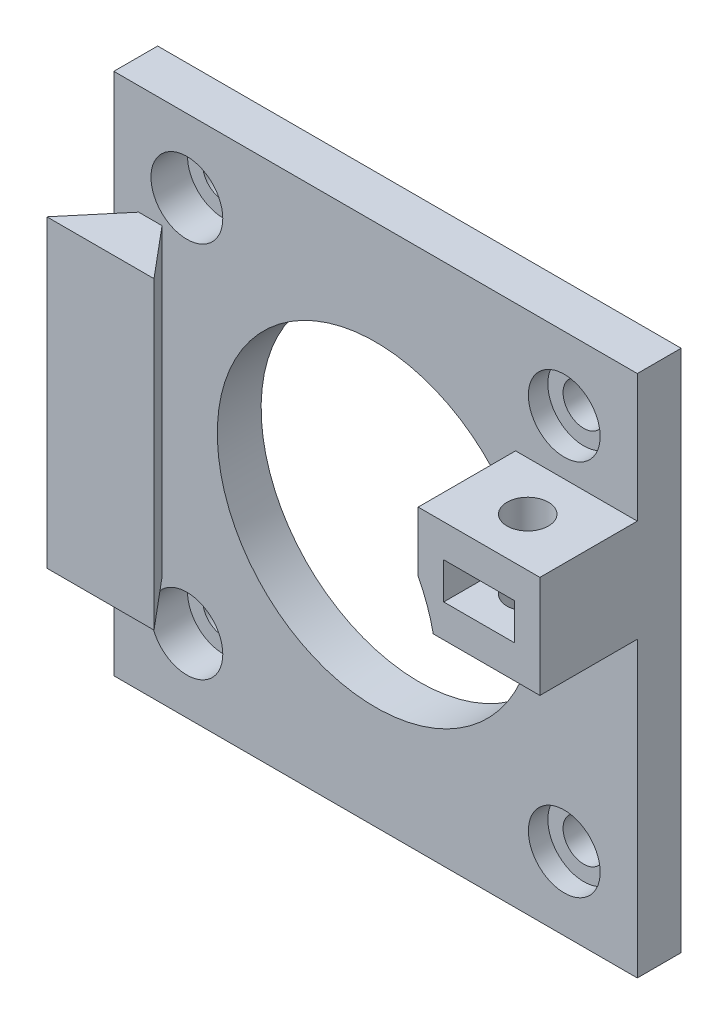
ISO-10303-21;
HEADER;
FILE_DESCRIPTION(('STEP AP214'),'2;1');
FILE_NAME('part.step','',(''),(''),'','','');
FILE_SCHEMA(('AUTOMOTIVE_DESIGN { 1 0 10303 214 1 1 1 1 }'));
ENDSEC;
DATA;
#1=APPLICATION_CONTEXT('core data for automotive mechanical design processes');
#2=APPLICATION_PROTOCOL_DEFINITION('international standard','automotive_design',2000,#1);
#3=PRODUCT_CONTEXT('',#1,'mechanical');
#4=PRODUCT('Part','Part','',(#3));
#5=PRODUCT_RELATED_PRODUCT_CATEGORY('part','',(#4));
#6=PRODUCT_DEFINITION_FORMATION('','',#4);
#7=PRODUCT_DEFINITION_CONTEXT('part definition',#1,'design');
#8=PRODUCT_DEFINITION('design','',#6,#7);
#9=PRODUCT_DEFINITION_SHAPE('','',#8);
#10=(LENGTH_UNIT() NAMED_UNIT(*) SI_UNIT(.MILLI.,.METRE.));
#11=(NAMED_UNIT(*) PLANE_ANGLE_UNIT() SI_UNIT($,.RADIAN.));
#12=(NAMED_UNIT(*) SI_UNIT($,.STERADIAN.) SOLID_ANGLE_UNIT());
#13=UNCERTAINTY_MEASURE_WITH_UNIT(LENGTH_MEASURE(1.E-05),#10,'distance_accuracy_value','');
#14=(GEOMETRIC_REPRESENTATION_CONTEXT(3) GLOBAL_UNCERTAINTY_ASSIGNED_CONTEXT((#13)) GLOBAL_UNIT_ASSIGNED_CONTEXT((#10,
#11,#12)) REPRESENTATION_CONTEXT('',''));
#15=CARTESIAN_POINT('',(0.,0.,0.));
#16=DIRECTION('',(0.,0.,1.));
#17=DIRECTION('',(1.,0.,0.));
#18=AXIS2_PLACEMENT_3D('',#15,#16,#17);
#19=CARTESIAN_POINT('',(-15.5,15.5,3.6));
#20=DIRECTION('',(0.,0.,-1.));
#21=DIRECTION('',(-1.,0.,0.));
#22=AXIS2_PLACEMENT_3D('',#19,#20,#21);
#23=CYLINDRICAL_SURFACE('',#22,1.7);
#24=CARTESIAN_POINT('',(-15.5,15.5,0.));
#25=DIRECTION('',(0.,0.,1.));
#26=DIRECTION('',(1.,0.,0.));
#27=AXIS2_PLACEMENT_3D('',#24,#25,#26);
#28=CIRCLE('',#27,1.7);
#29=CARTESIAN_POINT('',(-13.8,15.5,0.));
#30=VERTEX_POINT('',#29);
#31=EDGE_CURVE('E348',#30,#30,#28,.T.);
#32=ORIENTED_EDGE('',*,*,#31,.F.);
#33=EDGE_LOOP('',(#32));
#34=FACE_BOUND('',#33,.T.);
#35=CARTESIAN_POINT('',(-15.5,15.5,0.6));
#36=DIRECTION('',(0.,0.,1.));
#37=DIRECTION('',(1.,0.,0.));
#38=AXIS2_PLACEMENT_3D('',#35,#36,#37);
#39=CIRCLE('',#38,1.7);
#40=CARTESIAN_POINT('',(-13.8,15.5,0.6));
#41=VERTEX_POINT('',#40);
#42=EDGE_CURVE('E44',#41,#41,#39,.T.);
#43=ORIENTED_EDGE('',*,*,#42,.T.);
#44=EDGE_LOOP('',(#43));
#45=FACE_BOUND('',#44,.T.);
#46=ADVANCED_FACE('F40',(#34,#45),#23,.F.);
#47=CARTESIAN_POINT('',(-15.5,-15.5,3.6));
#48=DIRECTION('',(0.,0.,-1.));
#49=DIRECTION('',(-1.,0.,0.));
#50=AXIS2_PLACEMENT_3D('',#47,#48,#49);
#51=CYLINDRICAL_SURFACE('',#50,1.7);
#52=CARTESIAN_POINT('',(-15.5,-15.5,0.));
#53=DIRECTION('',(0.,0.,1.));
#54=DIRECTION('',(1.,0.,0.));
#55=AXIS2_PLACEMENT_3D('',#52,#53,#54);
#56=CIRCLE('',#55,1.7);
#57=CARTESIAN_POINT('',(-13.8,-15.5,0.));
#58=VERTEX_POINT('',#57);
#59=EDGE_CURVE('E344',#58,#58,#56,.T.);
#60=ORIENTED_EDGE('',*,*,#59,.F.);
#61=EDGE_LOOP('',(#60));
#62=FACE_BOUND('',#61,.T.);
#63=CARTESIAN_POINT('',(-15.5,-15.5,0.6));
#64=DIRECTION('',(0.,0.,1.));
#65=DIRECTION('',(1.,0.,0.));
#66=AXIS2_PLACEMENT_3D('',#63,#64,#65);
#67=CIRCLE('',#66,1.7);
#68=CARTESIAN_POINT('',(-13.8,-15.5,0.6));
#69=VERTEX_POINT('',#68);
#70=EDGE_CURVE('E197',#69,#69,#67,.T.);
#71=ORIENTED_EDGE('',*,*,#70,.T.);
#72=EDGE_LOOP('',(#71));
#73=FACE_BOUND('',#72,.T.);
#74=ADVANCED_FACE('F468',(#62,#73),#51,.F.);
#75=CARTESIAN_POINT('',(16.5,12.6,7.6));
#76=DIRECTION('',(0.,-1.,0.));
#77=DIRECTION('',(1.,0.,0.));
#78=AXIS2_PLACEMENT_3D('',#75,#76,#77);
#79=CYLINDRICAL_SURFACE('',#78,1.7);
#80=CARTESIAN_POINT('',(16.5,11.,7.6));
#81=DIRECTION('',(0.,-1.,0.));
#82=DIRECTION('',(1.,0.,0.));
#83=AXIS2_PLACEMENT_3D('',#80,#81,#82);
#84=CIRCLE('',#83,1.7);
#85=CARTESIAN_POINT('',(18.2,11.,7.6));
#86=VERTEX_POINT('',#85);
#87=EDGE_CURVE('E261',#86,#86,#84,.T.);
#88=ORIENTED_EDGE('',*,*,#87,.F.);
#89=EDGE_LOOP('',(#88));
#90=FACE_BOUND('',#89,.T.);
#91=CARTESIAN_POINT('',(16.5,8.29999999999988,7.6));
#92=DIRECTION('',(0.,-1.,0.));
#93=DIRECTION('',(1.,0.,0.));
#94=AXIS2_PLACEMENT_3D('',#91,#92,#93);
#95=CIRCLE('',#94,1.7);
#96=CARTESIAN_POINT('',(18.2,8.29999999999987,7.6));
#97=VERTEX_POINT('',#96);
#98=EDGE_CURVE('E248',#97,#97,#95,.F.);
#99=ORIENTED_EDGE('',*,*,#98,.F.);
#100=EDGE_LOOP('',(#99));
#101=FACE_BOUND('',#100,.T.);
#102=ADVANCED_FACE('F474',(#90,#101),#79,.F.);
#103=CARTESIAN_POINT('',(15.5,-15.5,3.6));
#104=DIRECTION('',(0.,0.,-1.));
#105=DIRECTION('',(-1.,0.,0.));
#106=AXIS2_PLACEMENT_3D('',#103,#104,#105);
#107=CYLINDRICAL_SURFACE('',#106,1.7);
#108=CARTESIAN_POINT('',(15.5,-15.5,0.));
#109=DIRECTION('',(0.,0.,1.));
#110=DIRECTION('',(1.,0.,0.));
#111=AXIS2_PLACEMENT_3D('',#108,#109,#110);
#112=CIRCLE('',#111,1.7);
#113=CARTESIAN_POINT('',(17.2,-15.5,0.));
#114=VERTEX_POINT('',#113);
#115=EDGE_CURVE('E339',#114,#114,#112,.T.);
#116=ORIENTED_EDGE('',*,*,#115,.F.);
#117=EDGE_LOOP('',(#116));
#118=FACE_BOUND('',#117,.T.);
#119=CARTESIAN_POINT('',(15.5,-15.5,2.));
#120=DIRECTION('',(0.,0.,1.));
#121=DIRECTION('',(1.,0.,0.));
#122=AXIS2_PLACEMENT_3D('',#119,#120,#121);
#123=CIRCLE('',#122,1.7);
#124=CARTESIAN_POINT('',(17.2,-15.5,2.));
#125=VERTEX_POINT('',#124);
#126=EDGE_CURVE('E340',#125,#125,#123,.T.);
#127=ORIENTED_EDGE('',*,*,#126,.T.);
#128=EDGE_LOOP('',(#127));
#129=FACE_BOUND('',#128,.T.);
#130=ADVANCED_FACE('F620',(#118,#129),#107,.F.);
#131=CARTESIAN_POINT('',(15.5,15.5,3.6));
#132=DIRECTION('',(0.,0.,-1.));
#133=DIRECTION('',(-1.,0.,0.));
#134=AXIS2_PLACEMENT_3D('',#131,#132,#133);
#135=CYLINDRICAL_SURFACE('',#134,1.7);
#136=CARTESIAN_POINT('',(15.5,15.5,0.));
#137=DIRECTION('',(0.,0.,1.));
#138=DIRECTION('',(1.,0.,0.));
#139=AXIS2_PLACEMENT_3D('',#136,#137,#138);
#140=CIRCLE('',#139,1.7);
#141=CARTESIAN_POINT('',(17.2,15.5,0.));
#142=VERTEX_POINT('',#141);
#143=EDGE_CURVE('E335',#142,#142,#140,.T.);
#144=ORIENTED_EDGE('',*,*,#143,.F.);
#145=EDGE_LOOP('',(#144));
#146=FACE_BOUND('',#145,.T.);
#147=CARTESIAN_POINT('',(15.5,15.5,2.));
#148=DIRECTION('',(0.,0.,1.));
#149=DIRECTION('',(1.,0.,0.));
#150=AXIS2_PLACEMENT_3D('',#147,#148,#149);
#151=CIRCLE('',#150,1.7);
#152=CARTESIAN_POINT('',(17.2,15.5,2.));
#153=VERTEX_POINT('',#152);
#154=EDGE_CURVE('E334',#153,#153,#151,.T.);
#155=ORIENTED_EDGE('',*,*,#154,.T.);
#156=EDGE_LOOP('',(#155));
#157=FACE_BOUND('',#156,.T.);
#158=ADVANCED_FACE('F491',(#146,#157),#135,.F.);
#159=CARTESIAN_POINT('',(0.,0.,3.6));
#160=DIRECTION('',(0.,0.,1.));
#161=DIRECTION('',(1.,0.,0.));
#162=AXIS2_PLACEMENT_3D('',#159,#160,#161);
#163=PLANE('',#162);
#164=DIRECTION('',(1.,0.,0.));
#165=VECTOR('',#164,1.);
#166=CARTESIAN_POINT('',(0.,-12.5,3.6));
#167=LINE('',#166,#165);
#168=CARTESIAN_POINT('',(-19.4596915121731,-12.5,3.6));
#169=VERTEX_POINT('',#168);
#170=CARTESIAN_POINT('',(-17.5403084878269,-12.5,3.6));
#171=VERTEX_POINT('',#170);
#172=EDGE_CURVE('E11',#169,#171,#167,.T.);
#173=ORIENTED_EDGE('',*,*,#172,.F.);
#174=DIRECTION('',(0.,-1.,0.));
#175=VECTOR('',#174,1.);
#176=CARTESIAN_POINT('',(-19.4596915121731,0.,3.6));
#177=LINE('',#176,#175);
#178=CARTESIAN_POINT('',(-19.4596915121731,12.5,3.6));
#179=VERTEX_POINT('',#178);
#180=EDGE_CURVE('E50',#179,#169,#177,.T.);
#181=ORIENTED_EDGE('',*,*,#180,.F.);
#182=DIRECTION('',(1.,0.,0.));
#183=VECTOR('',#182,1.);
#184=CARTESIAN_POINT('',(0.,12.5,3.6));
#185=LINE('',#184,#183);
#186=CARTESIAN_POINT('',(-17.5403084878269,12.5,3.6));
#187=VERTEX_POINT('',#186);
#188=EDGE_CURVE('E426',#179,#187,#185,.T.);
#189=ORIENTED_EDGE('',*,*,#188,.T.);
#190=DIRECTION('',(0.,1.,0.));
#191=VECTOR('',#190,1.);
#192=CARTESIAN_POINT('',(-17.5403084878269,0.,3.6));
#193=LINE('',#192,#191);
#194=EDGE_CURVE('E184',#171,#187,#193,.T.);
#195=ORIENTED_EDGE('',*,*,#194,.F.);
#196=EDGE_LOOP('',(#173,#181,#189,#195));
#197=FACE_BOUND('',#196,.T.);
#198=DIRECTION('',(0.,-1.,0.));
#199=VECTOR('',#198,1.);
#200=CARTESIAN_POINT('',(11.5,6.06217782649108,3.6));
#201=LINE('',#200,#199);
#202=CARTESIAN_POINT('',(11.5,11.,3.6));
#203=VERTEX_POINT('',#202);
#204=CARTESIAN_POINT('',(11.5,6.06217782649109,3.6));
#205=VERTEX_POINT('',#204);
#206=EDGE_CURVE('E280',#203,#205,#201,.T.);
#207=ORIENTED_EDGE('',*,*,#206,.F.);
#208=DIRECTION('',(-1.,0.,0.));
#209=VECTOR('',#208,1.);
#210=CARTESIAN_POINT('',(21.5,11.,3.6));
#211=LINE('',#210,#209);
#212=CARTESIAN_POINT('',(21.5,11.,3.6));
#213=VERTEX_POINT('',#212);
#214=EDGE_CURVE('E267',#213,#203,#211,.T.);
#215=ORIENTED_EDGE('',*,*,#214,.F.);
#216=DIRECTION('',(0.,1.,0.));
#217=VECTOR('',#216,1.);
#218=CARTESIAN_POINT('',(21.5,-21.5,3.6));
#219=LINE('',#218,#217);
#220=CARTESIAN_POINT('',(21.5,21.5,3.6));
#221=VERTEX_POINT('',#220);
#222=EDGE_CURVE('E369',#213,#221,#219,.T.);
#223=ORIENTED_EDGE('',*,*,#222,.T.);
#224=DIRECTION('',(-1.,0.,0.));
#225=VECTOR('',#224,1.);
#226=CARTESIAN_POINT('',(21.5,21.5,3.6));
#227=LINE('',#226,#225);
#228=CARTESIAN_POINT('',(-21.5,21.5,3.6));
#229=VERTEX_POINT('',#228);
#230=EDGE_CURVE('E373',#221,#229,#227,.T.);
#231=ORIENTED_EDGE('',*,*,#230,.T.);
#232=DIRECTION('',(0.,-1.,0.));
#233=VECTOR('',#232,1.);
#234=CARTESIAN_POINT('',(-21.5,-21.5,3.6));
#235=LINE('',#234,#233);
#236=CARTESIAN_POINT('',(-21.5,-21.5,3.6));
#237=VERTEX_POINT('',#236);
#238=EDGE_CURVE('E361',#229,#237,#235,.T.);
#239=ORIENTED_EDGE('',*,*,#238,.T.);
#240=DIRECTION('',(1.,0.,0.));
#241=VECTOR('',#240,1.);
#242=CARTESIAN_POINT('',(21.5,-21.5,3.6));
#243=LINE('',#242,#241);
#244=CARTESIAN_POINT('',(21.5,-21.5,3.6));
#245=VERTEX_POINT('',#244);
#246=EDGE_CURVE('E365',#237,#245,#243,.T.);
#247=ORIENTED_EDGE('',*,*,#246,.T.);
#248=CARTESIAN_POINT('',(21.5,2.6,3.6));
#249=VERTEX_POINT('',#248);
#250=EDGE_CURVE('E370',#245,#249,#219,.T.);
#251=ORIENTED_EDGE('',*,*,#250,.T.);
#252=DIRECTION('',(1.,0.,0.));
#253=VECTOR('',#252,1.);
#254=CARTESIAN_POINT('',(21.5,2.6,3.6));
#255=LINE('',#254,#253);
#256=CARTESIAN_POINT('',(12.7373466624725,2.6,3.6));
#257=VERTEX_POINT('',#256);
#258=EDGE_CURVE('E284',#257,#249,#255,.T.);
#259=ORIENTED_EDGE('',*,*,#258,.F.);
#260=CARTESIAN_POINT('',(0.,0.,3.6));
#261=DIRECTION('',(0.,0.,1.));
#262=DIRECTION('',(1.,0.,0.));
#263=AXIS2_PLACEMENT_3D('',#260,#261,#262);
#264=CIRCLE('',#263,13.);
#265=EDGE_CURVE('E353',#205,#257,#264,.T.);
#266=ORIENTED_EDGE('',*,*,#265,.F.);
#267=EDGE_LOOP('',(#207,#215,#223,#231,#239,#247,#251,#259,#266));
#268=FACE_BOUND('',#267,.T.);
#269=CARTESIAN_POINT('',(15.5,15.5,3.6));
#270=DIRECTION('',(0.,0.,1.));
#271=DIRECTION('',(1.,0.,0.));
#272=AXIS2_PLACEMENT_3D('',#269,#270,#271);
#273=CIRCLE('',#272,2.95);
#274=CARTESIAN_POINT('',(18.45,15.5,3.6));
#275=VERTEX_POINT('',#274);
#276=EDGE_CURVE('E324',#275,#275,#273,.T.);
#277=ORIENTED_EDGE('',*,*,#276,.F.);
#278=EDGE_LOOP('',(#277));
#279=FACE_BOUND('',#278,.T.);
#280=CARTESIAN_POINT('',(-15.5,-15.5,3.6));
#281=DIRECTION('',(0.,0.,1.));
#282=DIRECTION('',(1.,0.,0.));
#283=AXIS2_PLACEMENT_3D('',#280,#281,#282);
#284=CIRCLE('',#283,2.95);
#285=CARTESIAN_POINT('',(-12.55,-15.5,3.6));
#286=VERTEX_POINT('',#285);
#287=EDGE_CURVE('E315',#286,#286,#284,.T.);
#288=ORIENTED_EDGE('',*,*,#287,.F.);
#289=EDGE_LOOP('',(#288));
#290=FACE_BOUND('',#289,.T.);
#291=CARTESIAN_POINT('',(15.5,-15.5,3.6));
#292=DIRECTION('',(0.,0.,1.));
#293=DIRECTION('',(1.,0.,0.));
#294=AXIS2_PLACEMENT_3D('',#291,#292,#293);
#295=CIRCLE('',#294,2.95);
#296=CARTESIAN_POINT('',(18.45,-15.5,3.6));
#297=VERTEX_POINT('',#296);
#298=EDGE_CURVE('E310',#297,#297,#295,.T.);
#299=ORIENTED_EDGE('',*,*,#298,.F.);
#300=EDGE_LOOP('',(#299));
#301=FACE_BOUND('',#300,.T.);
#302=CARTESIAN_POINT('',(-15.5,15.5,3.6));
#303=DIRECTION('',(0.,0.,1.));
#304=DIRECTION('',(1.,0.,0.));
#305=AXIS2_PLACEMENT_3D('',#302,#303,#304);
#306=CIRCLE('',#305,2.95);
#307=CARTESIAN_POINT('',(-12.55,15.5,3.6));
#308=VERTEX_POINT('',#307);
#309=EDGE_CURVE('E323',#308,#308,#306,.T.);
#310=ORIENTED_EDGE('',*,*,#309,.F.);
#311=EDGE_LOOP('',(#310));
#312=FACE_BOUND('',#311,.T.);
#313=ADVANCED_FACE('F487',(#197,#268,#279,#290,#301,#312),#163,.T.);
#314=CARTESIAN_POINT('',(0.,0.,0.));
#315=DIRECTION('',(0.,0.,1.));
#316=DIRECTION('',(1.,0.,0.));
#317=AXIS2_PLACEMENT_3D('',#314,#315,#316);
#318=PLANE('',#317);
#319=DIRECTION('',(0.,-1.,0.));
#320=VECTOR('',#319,1.);
#321=CARTESIAN_POINT('',(-21.5,-21.5,0.));
#322=LINE('',#321,#320);
#323=CARTESIAN_POINT('',(-21.5,21.5,0.));
#324=VERTEX_POINT('',#323);
#325=CARTESIAN_POINT('',(-21.5,-21.5,0.));
#326=VERTEX_POINT('',#325);
#327=EDGE_CURVE('E357',#324,#326,#322,.T.);
#328=ORIENTED_EDGE('',*,*,#327,.F.);
#329=DIRECTION('',(-1.,0.,0.));
#330=VECTOR('',#329,1.);
#331=CARTESIAN_POINT('',(21.5,21.5,0.));
#332=LINE('',#331,#330);
#333=CARTESIAN_POINT('',(21.5,21.5,0.));
#334=VERTEX_POINT('',#333);
#335=EDGE_CURVE('E366',#334,#324,#332,.T.);
#336=ORIENTED_EDGE('',*,*,#335,.F.);
#337=DIRECTION('',(0.,1.,0.));
#338=VECTOR('',#337,1.);
#339=CARTESIAN_POINT('',(21.5,-21.5,0.));
#340=LINE('',#339,#338);
#341=CARTESIAN_POINT('',(21.5,-21.5,0.));
#342=VERTEX_POINT('',#341);
#343=EDGE_CURVE('E383',#342,#334,#340,.T.);
#344=ORIENTED_EDGE('',*,*,#343,.F.);
#345=DIRECTION('',(1.,0.,0.));
#346=VECTOR('',#345,1.);
#347=CARTESIAN_POINT('',(21.5,-21.5,0.));
#348=LINE('',#347,#346);
#349=EDGE_CURVE('E380',#326,#342,#348,.T.);
#350=ORIENTED_EDGE('',*,*,#349,.F.);
#351=EDGE_LOOP('',(#328,#336,#344,#350));
#352=FACE_BOUND('',#351,.T.);
#353=CARTESIAN_POINT('',(0.,0.,0.));
#354=DIRECTION('',(0.,0.,1.));
#355=DIRECTION('',(1.,0.,0.));
#356=AXIS2_PLACEMENT_3D('',#353,#354,#355);
#357=CIRCLE('',#356,13.);
#358=CARTESIAN_POINT('',(13.,0.,0.));
#359=VERTEX_POINT('',#358);
#360=EDGE_CURVE('E352',#359,#359,#357,.T.);
#361=ORIENTED_EDGE('',*,*,#360,.T.);
#362=EDGE_LOOP('',(#361));
#363=FACE_BOUND('',#362,.T.);
#364=ORIENTED_EDGE('',*,*,#31,.T.);
#365=EDGE_LOOP('',(#364));
#366=FACE_BOUND('',#365,.T.);
#367=ORIENTED_EDGE('',*,*,#59,.T.);
#368=EDGE_LOOP('',(#367));
#369=FACE_BOUND('',#368,.T.);
#370=ORIENTED_EDGE('',*,*,#115,.T.);
#371=EDGE_LOOP('',(#370));
#372=FACE_BOUND('',#371,.T.);
#373=ORIENTED_EDGE('',*,*,#143,.T.);
#374=EDGE_LOOP('',(#373));
#375=FACE_BOUND('',#374,.T.);
#376=ADVANCED_FACE('F490',(#352,#363,#366,#369,#372,#375),#318,.F.);
#377=CARTESIAN_POINT('',(-21.5,-21.5,3.6));
#378=DIRECTION('',(1.,0.,0.));
#379=DIRECTION('',(0.,0.,-1.));
#380=AXIS2_PLACEMENT_3D('',#377,#378,#379);
#381=PLANE('',#380);
#382=ORIENTED_EDGE('',*,*,#327,.T.);
#383=DIRECTION('',(0.,0.,-1.));
#384=VECTOR('',#383,1.);
#385=CARTESIAN_POINT('',(-21.5,-21.5,3.6));
#386=LINE('',#385,#384);
#387=EDGE_CURVE('E399',#237,#326,#386,.T.);
#388=ORIENTED_EDGE('',*,*,#387,.F.);
#389=ORIENTED_EDGE('',*,*,#238,.F.);
#390=DIRECTION('',(0.,0.,-1.));
#391=VECTOR('',#390,1.);
#392=CARTESIAN_POINT('',(-21.5,21.5,3.6));
#393=LINE('',#392,#391);
#394=EDGE_CURVE('E376',#229,#324,#393,.T.);
#395=ORIENTED_EDGE('',*,*,#394,.T.);
#396=EDGE_LOOP('',(#382,#388,#389,#395));
#397=FACE_BOUND('',#396,.T.);
#398=ADVANCED_FACE('F42',(#397),#381,.F.);
#399=CARTESIAN_POINT('',(21.5,-21.5,3.6));
#400=DIRECTION('',(0.,1.,0.));
#401=DIRECTION('',(-1.,0.,0.));
#402=AXIS2_PLACEMENT_3D('',#399,#400,#401);
#403=PLANE('',#402);
#404=ORIENTED_EDGE('',*,*,#349,.T.);
#405=DIRECTION('',(0.,0.,-1.));
#406=VECTOR('',#405,1.);
#407=CARTESIAN_POINT('',(21.5,-21.5,3.6));
#408=LINE('',#407,#406);
#409=EDGE_CURVE('E395',#245,#342,#408,.T.);
#410=ORIENTED_EDGE('',*,*,#409,.F.);
#411=ORIENTED_EDGE('',*,*,#246,.F.);
#412=ORIENTED_EDGE('',*,*,#387,.T.);
#413=EDGE_LOOP('',(#404,#410,#411,#412));
#414=FACE_BOUND('',#413,.T.);
#415=ADVANCED_FACE('F501',(#414),#403,.F.);
#416=CARTESIAN_POINT('',(21.5,-21.5,3.6));
#417=DIRECTION('',(-1.,0.,0.));
#418=DIRECTION('',(0.,0.,1.));
#419=AXIS2_PLACEMENT_3D('',#416,#417,#418);
#420=PLANE('',#419);
#421=ORIENTED_EDGE('',*,*,#343,.T.);
#422=DIRECTION('',(0.,0.,-1.));
#423=VECTOR('',#422,1.);
#424=CARTESIAN_POINT('',(21.5,21.5,3.6));
#425=LINE('',#424,#423);
#426=EDGE_CURVE('E391',#221,#334,#425,.T.);
#427=ORIENTED_EDGE('',*,*,#426,.F.);
#428=ORIENTED_EDGE('',*,*,#222,.F.);
#429=DIRECTION('',(0.,0.,-1.));
#430=VECTOR('',#429,1.);
#431=CARTESIAN_POINT('',(21.5,11.,11.6));
#432=LINE('',#431,#430);
#433=CARTESIAN_POINT('',(21.5,11.,11.6));
#434=VERTEX_POINT('',#433);
#435=EDGE_CURVE('E294',#434,#213,#432,.T.);
#436=ORIENTED_EDGE('',*,*,#435,.F.);
#437=DIRECTION('',(0.,1.,0.));
#438=VECTOR('',#437,1.);
#439=CARTESIAN_POINT('',(21.5,2.6,11.6));
#440=LINE('',#439,#438);
#441=CARTESIAN_POINT('',(21.5,2.6,11.6));
#442=VERTEX_POINT('',#441);
#443=EDGE_CURVE('E273',#442,#434,#440,.T.);
#444=ORIENTED_EDGE('',*,*,#443,.F.);
#445=DIRECTION('',(0.,0.,-1.));
#446=VECTOR('',#445,1.);
#447=CARTESIAN_POINT('',(21.5,2.6,11.6));
#448=LINE('',#447,#446);
#449=EDGE_CURVE('E298',#442,#249,#448,.T.);
#450=ORIENTED_EDGE('',*,*,#449,.T.);
#451=ORIENTED_EDGE('',*,*,#250,.F.);
#452=ORIENTED_EDGE('',*,*,#409,.T.);
#453=EDGE_LOOP('',(#421,#427,#428,#436,#444,#450,#451,#452));
#454=FACE_BOUND('',#453,.T.);
#455=ADVANCED_FACE('F498',(#454),#420,.F.);
#456=CARTESIAN_POINT('',(21.5,21.5,3.6));
#457=DIRECTION('',(0.,-1.,0.));
#458=DIRECTION('',(1.,0.,0.));
#459=AXIS2_PLACEMENT_3D('',#456,#457,#458);
#460=PLANE('',#459);
#461=ORIENTED_EDGE('',*,*,#335,.T.);
#462=ORIENTED_EDGE('',*,*,#394,.F.);
#463=ORIENTED_EDGE('',*,*,#230,.F.);
#464=ORIENTED_EDGE('',*,*,#426,.T.);
#465=EDGE_LOOP('',(#461,#462,#463,#464));
#466=FACE_BOUND('',#465,.T.);
#467=ADVANCED_FACE('F485',(#466),#460,.F.);
#468=CARTESIAN_POINT('',(0.,0.,3.6));
#469=DIRECTION('',(0.,0.,-1.));
#470=DIRECTION('',(-1.,0.,0.));
#471=AXIS2_PLACEMENT_3D('',#468,#469,#470);
#472=CYLINDRICAL_SURFACE('',#471,13.);
#473=ORIENTED_EDGE('',*,*,#265,.T.);
#474=DIRECTION('',(0.,0.,-1.));
#475=VECTOR('',#474,1.);
#476=CARTESIAN_POINT('',(12.7373466624725,2.6,11.6));
#477=LINE('',#476,#475);
#478=CARTESIAN_POINT('',(12.7373466624725,2.6,11.6));
#479=VERTEX_POINT('',#478);
#480=EDGE_CURVE('E302',#479,#257,#477,.T.);
#481=ORIENTED_EDGE('',*,*,#480,.F.);
#482=CARTESIAN_POINT('',(0.,0.,11.6));
#483=DIRECTION('',(0.,0.,-1.));
#484=DIRECTION('',(1.,0.,0.));
#485=AXIS2_PLACEMENT_3D('',#482,#483,#484);
#486=CIRCLE('',#485,13.);
#487=CARTESIAN_POINT('',(11.5,6.06217782649108,11.6));
#488=VERTEX_POINT('',#487);
#489=EDGE_CURVE('E266',#488,#479,#486,.T.);
#490=ORIENTED_EDGE('',*,*,#489,.F.);
#491=DIRECTION('',(0.,0.,-1.));
#492=VECTOR('',#491,1.);
#493=CARTESIAN_POINT('',(11.5,6.06217782649108,11.6));
#494=LINE('',#493,#492);
#495=EDGE_CURVE('E306',#488,#205,#494,.T.);
#496=ORIENTED_EDGE('',*,*,#495,.T.);
#497=EDGE_LOOP('',(#473,#481,#490,#496));
#498=FACE_BOUND('',#497,.T.);
#499=ORIENTED_EDGE('',*,*,#360,.F.);
#500=EDGE_LOOP('',(#499));
#501=FACE_BOUND('',#500,.T.);
#502=ADVANCED_FACE('F481',(#498,#501),#472,.F.);
#503=CARTESIAN_POINT('',(15.5,15.5,2.));
#504=DIRECTION('',(0.,0.,1.));
#505=DIRECTION('',(1.,0.,0.));
#506=AXIS2_PLACEMENT_3D('',#503,#504,#505);
#507=CYLINDRICAL_SURFACE('',#506,2.95);
#508=CARTESIAN_POINT('',(15.5,15.5,2.));
#509=DIRECTION('',(0.,0.,1.));
#510=DIRECTION('',(1.,0.,0.));
#511=AXIS2_PLACEMENT_3D('',#508,#509,#510);
#512=CIRCLE('',#511,2.95);
#513=CARTESIAN_POINT('',(18.45,15.5,2.));
#514=VERTEX_POINT('',#513);
#515=EDGE_CURVE('E319',#514,#514,#512,.T.);
#516=ORIENTED_EDGE('',*,*,#515,.F.);
#517=EDGE_LOOP('',(#516));
#518=FACE_BOUND('',#517,.T.);
#519=ORIENTED_EDGE('',*,*,#276,.T.);
#520=EDGE_LOOP('',(#519));
#521=FACE_BOUND('',#520,.T.);
#522=ADVANCED_FACE('F484',(#518,#521),#507,.F.);
#523=CARTESIAN_POINT('',(15.5,15.5,2.));
#524=DIRECTION('',(0.,0.,1.));
#525=DIRECTION('',(1.,0.,0.));
#526=AXIS2_PLACEMENT_3D('',#523,#524,#525);
#527=PLANE('',#526);
#528=ORIENTED_EDGE('',*,*,#154,.F.);
#529=EDGE_LOOP('',(#528));
#530=FACE_BOUND('',#529,.T.);
#531=ORIENTED_EDGE('',*,*,#515,.T.);
#532=EDGE_LOOP('',(#531));
#533=FACE_BOUND('',#532,.T.);
#534=ADVANCED_FACE('F623',(#530,#533),#527,.T.);
#535=CARTESIAN_POINT('',(15.5,-15.5,2.));
#536=DIRECTION('',(0.,0.,1.));
#537=DIRECTION('',(1.,0.,0.));
#538=AXIS2_PLACEMENT_3D('',#535,#536,#537);
#539=CYLINDRICAL_SURFACE('',#538,2.95);
#540=CARTESIAN_POINT('',(15.5,-15.5,2.));
#541=DIRECTION('',(0.,0.,1.));
#542=DIRECTION('',(1.,0.,0.));
#543=AXIS2_PLACEMENT_3D('',#540,#541,#542);
#544=CIRCLE('',#543,2.95);
#545=CARTESIAN_POINT('',(18.45,-15.5,2.));
#546=VERTEX_POINT('',#545);
#547=EDGE_CURVE('E311',#546,#546,#544,.T.);
#548=ORIENTED_EDGE('',*,*,#547,.F.);
#549=EDGE_LOOP('',(#548));
#550=FACE_BOUND('',#549,.T.);
#551=ORIENTED_EDGE('',*,*,#298,.T.);
#552=EDGE_LOOP('',(#551));
#553=FACE_BOUND('',#552,.T.);
#554=ADVANCED_FACE('F626',(#550,#553),#539,.F.);
#555=CARTESIAN_POINT('',(15.5,-15.5,2.));
#556=DIRECTION('',(0.,0.,1.));
#557=DIRECTION('',(1.,0.,0.));
#558=AXIS2_PLACEMENT_3D('',#555,#556,#557);
#559=PLANE('',#558);
#560=ORIENTED_EDGE('',*,*,#126,.F.);
#561=EDGE_LOOP('',(#560));
#562=FACE_BOUND('',#561,.T.);
#563=ORIENTED_EDGE('',*,*,#547,.T.);
#564=EDGE_LOOP('',(#563));
#565=FACE_BOUND('',#564,.T.);
#566=ADVANCED_FACE('F463',(#562,#565),#559,.T.);
#567=CARTESIAN_POINT('',(-15.5,-15.5,2.));
#568=DIRECTION('',(0.,0.,1.));
#569=DIRECTION('',(1.,0.,0.));
#570=AXIS2_PLACEMENT_3D('',#567,#568,#569);
#571=CYLINDRICAL_SURFACE('',#570,2.95);
#572=ORIENTED_EDGE('',*,*,#287,.T.);
#573=EDGE_LOOP('',(#572));
#574=FACE_BOUND('',#573,.T.);
#575=CARTESIAN_POINT('',(-15.5,-15.5,0.6));
#576=DIRECTION('',(0.,0.,1.));
#577=DIRECTION('',(1.,0.,0.));
#578=AXIS2_PLACEMENT_3D('',#575,#576,#577);
#579=CIRCLE('',#578,2.95);
#580=CARTESIAN_POINT('',(-12.55,-15.5,0.6));
#581=VERTEX_POINT('',#580);
#582=EDGE_CURVE('E434',#581,#581,#579,.T.);
#583=ORIENTED_EDGE('',*,*,#582,.F.);
#584=EDGE_LOOP('',(#583));
#585=FACE_BOUND('',#584,.T.);
#586=ADVANCED_FACE('F453',(#574,#585),#571,.F.);
#587=CARTESIAN_POINT('',(-15.5,15.5,2.));
#588=DIRECTION('',(0.,0.,1.));
#589=DIRECTION('',(1.,0.,0.));
#590=AXIS2_PLACEMENT_3D('',#587,#588,#589);
#591=CYLINDRICAL_SURFACE('',#590,2.95);
#592=ORIENTED_EDGE('',*,*,#309,.T.);
#593=EDGE_LOOP('',(#592));
#594=FACE_BOUND('',#593,.T.);
#595=CARTESIAN_POINT('',(-15.5,15.5,0.6));
#596=DIRECTION('',(0.,0.,1.));
#597=DIRECTION('',(1.,0.,0.));
#598=AXIS2_PLACEMENT_3D('',#595,#596,#597);
#599=CIRCLE('',#598,2.95);
#600=CARTESIAN_POINT('',(-12.55,15.5,0.6));
#601=VERTEX_POINT('',#600);
#602=EDGE_CURVE('E199',#601,#601,#599,.T.);
#603=ORIENTED_EDGE('',*,*,#602,.F.);
#604=EDGE_LOOP('',(#603));
#605=FACE_BOUND('',#604,.T.);
#606=ADVANCED_FACE('F450',(#594,#605),#591,.F.);
#607=CARTESIAN_POINT('',(11.5,6.06217782649108,11.6));
#608=DIRECTION('',(1.,0.,0.));
#609=DIRECTION('',(0.,0.,-1.));
#610=AXIS2_PLACEMENT_3D('',#607,#608,#609);
#611=PLANE('',#610);
#612=ORIENTED_EDGE('',*,*,#206,.T.);
#613=ORIENTED_EDGE('',*,*,#495,.F.);
#614=DIRECTION('',(0.,-1.,0.));
#615=VECTOR('',#614,1.);
#616=CARTESIAN_POINT('',(11.5,6.06217782649108,11.6));
#617=LINE('',#616,#615);
#618=CARTESIAN_POINT('',(11.5,11.,11.6));
#619=VERTEX_POINT('',#618);
#620=EDGE_CURVE('E262',#619,#488,#617,.T.);
#621=ORIENTED_EDGE('',*,*,#620,.F.);
#622=DIRECTION('',(0.,0.,-1.));
#623=VECTOR('',#622,1.);
#624=CARTESIAN_POINT('',(11.5,11.,11.6));
#625=LINE('',#624,#623);
#626=EDGE_CURVE('E279',#619,#203,#625,.T.);
#627=ORIENTED_EDGE('',*,*,#626,.T.);
#628=EDGE_LOOP('',(#612,#613,#621,#627));
#629=FACE_BOUND('',#628,.T.);
#630=ADVANCED_FACE('F452',(#629),#611,.F.);
#631=CARTESIAN_POINT('',(21.5,2.6,11.6));
#632=DIRECTION('',(0.,1.,0.));
#633=DIRECTION('',(-1.,0.,0.));
#634=AXIS2_PLACEMENT_3D('',#631,#632,#633);
#635=PLANE('',#634);
#636=CARTESIAN_POINT('',(16.5,2.6,7.6));
#637=DIRECTION('',(0.,-1.,0.));
#638=DIRECTION('',(1.,0.,0.));
#639=AXIS2_PLACEMENT_3D('',#636,#637,#638);
#640=CIRCLE('',#639,1.7);
#641=CARTESIAN_POINT('',(18.2,2.6,7.6));
#642=VERTEX_POINT('',#641);
#643=EDGE_CURVE('E257',#642,#642,#640,.T.);
#644=ORIENTED_EDGE('',*,*,#643,.F.);
#645=EDGE_LOOP('',(#644));
#646=FACE_BOUND('',#645,.T.);
#647=ORIENTED_EDGE('',*,*,#258,.T.);
#648=ORIENTED_EDGE('',*,*,#449,.F.);
#649=DIRECTION('',(1.,0.,0.));
#650=VECTOR('',#649,1.);
#651=CARTESIAN_POINT('',(21.5,2.6,11.6));
#652=LINE('',#651,#650);
#653=EDGE_CURVE('E270',#479,#442,#652,.T.);
#654=ORIENTED_EDGE('',*,*,#653,.F.);
#655=ORIENTED_EDGE('',*,*,#480,.T.);
#656=EDGE_LOOP('',(#647,#648,#654,#655));
#657=FACE_BOUND('',#656,.T.);
#658=ADVANCED_FACE('F460',(#646,#657),#635,.F.);
#659=CARTESIAN_POINT('',(21.5,11.,11.6));
#660=DIRECTION('',(0.,-1.,0.));
#661=DIRECTION('',(1.,0.,0.));
#662=AXIS2_PLACEMENT_3D('',#659,#660,#661);
#663=PLANE('',#662);
#664=ORIENTED_EDGE('',*,*,#87,.T.);
#665=EDGE_LOOP('',(#664));
#666=FACE_BOUND('',#665,.T.);
#667=ORIENTED_EDGE('',*,*,#214,.T.);
#668=ORIENTED_EDGE('',*,*,#626,.F.);
#669=DIRECTION('',(-1.,0.,0.));
#670=VECTOR('',#669,1.);
#671=CARTESIAN_POINT('',(21.5,11.,11.6));
#672=LINE('',#671,#670);
#673=EDGE_CURVE('E276',#434,#619,#672,.T.);
#674=ORIENTED_EDGE('',*,*,#673,.F.);
#675=ORIENTED_EDGE('',*,*,#435,.T.);
#676=EDGE_LOOP('',(#667,#668,#674,#675));
#677=FACE_BOUND('',#676,.T.);
#678=ADVANCED_FACE('F598',(#666,#677),#663,.F.);
#679=CARTESIAN_POINT('',(0.,0.,11.6));
#680=DIRECTION('',(0.,0.,1.));
#681=DIRECTION('',(1.,0.,0.));
#682=AXIS2_PLACEMENT_3D('',#679,#680,#681);
#683=PLANE('',#682);
#684=DIRECTION('',(1.,0.,0.));
#685=VECTOR('',#684,1.);
#686=CARTESIAN_POINT('',(0.,5.3,11.6));
#687=LINE('',#686,#685);
#688=CARTESIAN_POINT('',(13.5988148973221,5.29999999999991,11.6));
#689=VERTEX_POINT('',#688);
#690=CARTESIAN_POINT('',(19.4011851026779,5.29999999999986,11.6));
#691=VERTEX_POINT('',#690);
#692=EDGE_CURVE('E254',#689,#691,#687,.T.);
#693=ORIENTED_EDGE('',*,*,#692,.F.);
#694=DIRECTION('',(0.,1.,0.));
#695=VECTOR('',#694,1.);
#696=CARTESIAN_POINT('',(13.5988148973221,0.,11.6));
#697=LINE('',#696,#695);
#698=CARTESIAN_POINT('',(13.5988148973222,8.2999999999999,11.6));
#699=VERTEX_POINT('',#698);
#700=EDGE_CURVE('E403',#689,#699,#697,.T.);
#701=ORIENTED_EDGE('',*,*,#700,.T.);
#702=DIRECTION('',(1.,0.,0.));
#703=VECTOR('',#702,1.);
#704=CARTESIAN_POINT('',(0.,8.3,11.6));
#705=LINE('',#704,#703);
#706=CARTESIAN_POINT('',(19.4011851026779,8.29999999999986,11.6));
#707=VERTEX_POINT('',#706);
#708=EDGE_CURVE('E249',#699,#707,#705,.T.);
#709=ORIENTED_EDGE('',*,*,#708,.T.);
#710=DIRECTION('',(0.,-1.,0.));
#711=VECTOR('',#710,1.);
#712=CARTESIAN_POINT('',(19.4011851026778,-1.35477751474882E-13,11.6));
#713=LINE('',#712,#711);
#714=EDGE_CURVE('E422',#707,#691,#713,.T.);
#715=ORIENTED_EDGE('',*,*,#714,.T.);
#716=EDGE_LOOP('',(#693,#701,#709,#715));
#717=FACE_BOUND('',#716,.T.);
#718=ORIENTED_EDGE('',*,*,#620,.T.);
#719=ORIENTED_EDGE('',*,*,#489,.T.);
#720=ORIENTED_EDGE('',*,*,#653,.T.);
#721=ORIENTED_EDGE('',*,*,#443,.T.);
#722=ORIENTED_EDGE('',*,*,#673,.T.);
#723=EDGE_LOOP('',(#718,#719,#720,#721,#722));
#724=FACE_BOUND('',#723,.T.);
#725=ADVANCED_FACE('F602',(#717,#724),#683,.T.);
#726=CARTESIAN_POINT('',(16.5,5.29999999999988,7.6));
#727=DIRECTION('',(0.,-1.,0.));
#728=DIRECTION('',(1.,0.,0.));
#729=AXIS2_PLACEMENT_3D('',#726,#727,#728);
#730=CIRCLE('',#729,1.7);
#731=CARTESIAN_POINT('',(18.2,5.29999999999987,7.6));
#732=VERTEX_POINT('',#731);
#733=EDGE_CURVE('E253',#732,#732,#730,.F.);
#734=ORIENTED_EDGE('',*,*,#733,.T.);
#735=EDGE_LOOP('',(#734));
#736=FACE_BOUND('',#735,.T.);
#737=ORIENTED_EDGE('',*,*,#643,.T.);
#738=EDGE_LOOP('',(#737));
#739=FACE_BOUND('',#738,.T.);
#740=ADVANCED_FACE('F659',(#736,#739),#79,.F.);
#741=CARTESIAN_POINT('',(0.,5.3,0.));
#742=DIRECTION('',(0.,-1.,0.));
#743=DIRECTION('',(1.,0.,0.));
#744=AXIS2_PLACEMENT_3D('',#741,#742,#743);
#745=PLANE('',#744);
#746=ORIENTED_EDGE('',*,*,#692,.T.);
#747=DIRECTION('',(0.,0.,1.));
#748=VECTOR('',#747,1.);
#749=CARTESIAN_POINT('',(19.4011851026779,5.29999999999986,5.925));
#750=LINE('',#749,#748);
#751=CARTESIAN_POINT('',(19.4011851026779,5.29999999999986,5.925));
#752=VERTEX_POINT('',#751);
#753=EDGE_CURVE('E234',#752,#691,#750,.T.);
#754=ORIENTED_EDGE('',*,*,#753,.F.);
#755=DIRECTION('',(0.866025403784439,0.,0.5));
#756=VECTOR('',#755,1.);
#757=CARTESIAN_POINT('',(16.5,5.29999999999988,4.25));
#758=LINE('',#757,#756);
#759=CARTESIAN_POINT('',(16.5,5.29999999999988,4.25));
#760=VERTEX_POINT('',#759);
#761=EDGE_CURVE('E231',#760,#752,#758,.T.);
#762=ORIENTED_EDGE('',*,*,#761,.F.);
#763=DIRECTION('',(0.866025403784439,0.,-0.5));
#764=VECTOR('',#763,1.);
#765=CARTESIAN_POINT('',(13.5988148973221,5.29999999999991,5.925));
#766=LINE('',#765,#764);
#767=CARTESIAN_POINT('',(13.5988148973221,5.29999999999991,5.925));
#768=VERTEX_POINT('',#767);
#769=EDGE_CURVE('E228',#768,#760,#766,.T.);
#770=ORIENTED_EDGE('',*,*,#769,.F.);
#771=DIRECTION('',(0.,0.,-1.));
#772=VECTOR('',#771,1.);
#773=CARTESIAN_POINT('',(13.5988148973221,5.29999999999991,9.275));
#774=LINE('',#773,#772);
#775=EDGE_CURVE('E225',#689,#768,#774,.T.);
#776=ORIENTED_EDGE('',*,*,#775,.F.);
#777=EDGE_LOOP('',(#746,#754,#762,#770,#776));
#778=FACE_BOUND('',#777,.T.);
#779=ORIENTED_EDGE('',*,*,#733,.F.);
#780=EDGE_LOOP('',(#779));
#781=FACE_BOUND('',#780,.T.);
#782=ADVANCED_FACE('F663',(#778,#781),#745,.F.);
#783=CARTESIAN_POINT('',(0.,8.3,0.));
#784=DIRECTION('',(0.,-1.,0.));
#785=DIRECTION('',(1.,0.,0.));
#786=AXIS2_PLACEMENT_3D('',#783,#784,#785);
#787=PLANE('',#786);
#788=DIRECTION('',(0.,0.,-1.));
#789=VECTOR('',#788,1.);
#790=CARTESIAN_POINT('',(13.5988148973222,8.2999999999999,9.275));
#791=LINE('',#790,#789);
#792=CARTESIAN_POINT('',(13.5988148973222,8.2999999999999,5.925));
#793=VERTEX_POINT('',#792);
#794=EDGE_CURVE('E212',#699,#793,#791,.T.);
#795=ORIENTED_EDGE('',*,*,#794,.T.);
#796=DIRECTION('',(0.866025403784439,0.,-0.5));
#797=VECTOR('',#796,1.);
#798=CARTESIAN_POINT('',(13.5988148973222,8.2999999999999,5.925));
#799=LINE('',#798,#797);
#800=CARTESIAN_POINT('',(16.5,8.29999999999988,4.25));
#801=VERTEX_POINT('',#800);
#802=EDGE_CURVE('E216',#793,#801,#799,.T.);
#803=ORIENTED_EDGE('',*,*,#802,.T.);
#804=DIRECTION('',(0.866025403784439,0.,0.5));
#805=VECTOR('',#804,1.);
#806=CARTESIAN_POINT('',(16.5,8.29999999999988,4.25));
#807=LINE('',#806,#805);
#808=CARTESIAN_POINT('',(19.4011851026779,8.29999999999986,5.925));
#809=VERTEX_POINT('',#808);
#810=EDGE_CURVE('E220',#801,#809,#807,.T.);
#811=ORIENTED_EDGE('',*,*,#810,.T.);
#812=DIRECTION('',(0.,0.,1.));
#813=VECTOR('',#812,1.);
#814=CARTESIAN_POINT('',(19.4011851026779,8.29999999999986,5.925));
#815=LINE('',#814,#813);
#816=EDGE_CURVE('E66',#809,#707,#815,.T.);
#817=ORIENTED_EDGE('',*,*,#816,.T.);
#818=ORIENTED_EDGE('',*,*,#708,.F.);
#819=EDGE_LOOP('',(#795,#803,#811,#817,#818));
#820=FACE_BOUND('',#819,.T.);
#821=ORIENTED_EDGE('',*,*,#98,.T.);
#822=EDGE_LOOP('',(#821));
#823=FACE_BOUND('',#822,.T.);
#824=ADVANCED_FACE('F669',(#820,#823),#787,.T.);
#825=CARTESIAN_POINT('',(13.5988148973221,5.29999999999991,5.925));
#826=DIRECTION('',(0.5,0.,0.866025403784439));
#827=DIRECTION('',(0.866025403784439,0.,-0.5));
#828=AXIS2_PLACEMENT_3D('',#825,#826,#827);
#829=PLANE('',#828);
#830=DIRECTION('',(0.,1.,0.));
#831=VECTOR('',#830,1.);
#832=CARTESIAN_POINT('',(13.5988148973221,5.29999999999991,5.925));
#833=LINE('',#832,#831);
#834=EDGE_CURVE('E244',#768,#793,#833,.T.);
#835=ORIENTED_EDGE('',*,*,#834,.F.);
#836=ORIENTED_EDGE('',*,*,#769,.T.);
#837=DIRECTION('',(0.,1.,0.));
#838=VECTOR('',#837,1.);
#839=CARTESIAN_POINT('',(16.5,5.29999999999988,4.25));
#840=LINE('',#839,#838);
#841=EDGE_CURVE('E241',#760,#801,#840,.T.);
#842=ORIENTED_EDGE('',*,*,#841,.T.);
#843=ORIENTED_EDGE('',*,*,#802,.F.);
#844=EDGE_LOOP('',(#835,#836,#842,#843));
#845=FACE_BOUND('',#844,.T.);
#846=ADVANCED_FACE('F665',(#845),#829,.T.);
#847=CARTESIAN_POINT('',(16.5,5.29999999999988,4.25));
#848=DIRECTION('',(-0.5,0.,0.866025403784439));
#849=DIRECTION('',(0.866025403784439,0.,0.5));
#850=AXIS2_PLACEMENT_3D('',#847,#848,#849);
#851=PLANE('',#850);
#852=ORIENTED_EDGE('',*,*,#841,.F.);
#853=ORIENTED_EDGE('',*,*,#761,.T.);
#854=DIRECTION('',(0.,1.,0.));
#855=VECTOR('',#854,1.);
#856=CARTESIAN_POINT('',(19.4011851026779,5.29999999999986,5.925));
#857=LINE('',#856,#855);
#858=EDGE_CURVE('E238',#752,#809,#857,.T.);
#859=ORIENTED_EDGE('',*,*,#858,.T.);
#860=ORIENTED_EDGE('',*,*,#810,.F.);
#861=EDGE_LOOP('',(#852,#853,#859,#860));
#862=FACE_BOUND('',#861,.T.);
#863=ADVANCED_FACE('F668',(#862),#851,.T.);
#864=CARTESIAN_POINT('',(19.4011851026779,5.29999999999986,15.925));
#865=DIRECTION('',(-1.,0.,0.));
#866=DIRECTION('',(0.,-1.,0.));
#867=AXIS2_PLACEMENT_3D('',#864,#865,#866);
#868=PLANE('',#867);
#869=ORIENTED_EDGE('',*,*,#816,.F.);
#870=ORIENTED_EDGE('',*,*,#858,.F.);
#871=ORIENTED_EDGE('',*,*,#753,.T.);
#872=ORIENTED_EDGE('',*,*,#714,.F.);
#873=EDGE_LOOP('',(#869,#870,#871,#872));
#874=FACE_BOUND('',#873,.T.);
#875=ADVANCED_FACE('F673',(#874),#868,.T.);
#876=CARTESIAN_POINT('',(13.5988148973221,5.29999999999991,9.275));
#877=DIRECTION('',(1.,0.,0.));
#878=DIRECTION('',(0.,1.,0.));
#879=AXIS2_PLACEMENT_3D('',#876,#877,#878);
#880=PLANE('',#879);
#881=ORIENTED_EDGE('',*,*,#775,.T.);
#882=ORIENTED_EDGE('',*,*,#834,.T.);
#883=ORIENTED_EDGE('',*,*,#794,.F.);
#884=ORIENTED_EDGE('',*,*,#700,.F.);
#885=EDGE_LOOP('',(#881,#882,#883,#884));
#886=FACE_BOUND('',#885,.T.);
#887=ADVANCED_FACE('F677',(#886),#880,.T.);
#888=CARTESIAN_POINT('',(-14.1,-12.5,7.7));
#889=DIRECTION('',(0.,0.,1.));
#890=DIRECTION('',(1.,0.,0.));
#891=AXIS2_PLACEMENT_3D('',#888,#889,#890);
#892=PLANE('',#891);
#893=DIRECTION('',(0.,1.,0.));
#894=VECTOR('',#893,1.);
#895=CARTESIAN_POINT('',(-14.1,-12.5,7.7));
#896=LINE('',#895,#894);
#897=CARTESIAN_POINT('',(-14.1,-12.5,7.7));
#898=VERTEX_POINT('',#897);
#899=CARTESIAN_POINT('',(-14.1,12.5,7.7));
#900=VERTEX_POINT('',#899);
#901=EDGE_CURVE('E169',#898,#900,#896,.T.);
#902=ORIENTED_EDGE('',*,*,#901,.T.);
#903=DIRECTION('',(1.,0.,0.));
#904=VECTOR('',#903,1.);
#905=CARTESIAN_POINT('',(-14.1,12.5,7.7));
#906=LINE('',#905,#904);
#907=CARTESIAN_POINT('',(-22.9,12.5,7.7));
#908=VERTEX_POINT('',#907);
#909=EDGE_CURVE('E172',#908,#900,#906,.T.);
#910=ORIENTED_EDGE('',*,*,#909,.F.);
#911=DIRECTION('',(0.,1.,0.));
#912=VECTOR('',#911,1.);
#913=CARTESIAN_POINT('',(-22.9,-12.5,7.7));
#914=LINE('',#913,#912);
#915=CARTESIAN_POINT('',(-22.9,-12.5,7.7));
#916=VERTEX_POINT('',#915);
#917=EDGE_CURVE('E179',#916,#908,#914,.T.);
#918=ORIENTED_EDGE('',*,*,#917,.F.);
#919=DIRECTION('',(1.,0.,0.));
#920=VECTOR('',#919,1.);
#921=CARTESIAN_POINT('',(-14.1,-12.5,7.7));
#922=LINE('',#921,#920);
#923=EDGE_CURVE('E174',#916,#898,#922,.T.);
#924=ORIENTED_EDGE('',*,*,#923,.T.);
#925=EDGE_LOOP('',(#902,#910,#918,#924));
#926=FACE_BOUND('',#925,.T.);
#927=ADVANCED_FACE('F170',(#926),#892,.T.);
#928=CARTESIAN_POINT('',(-22.9,-12.5,7.7));
#929=DIRECTION('',(-0.766044443118975,0.,-0.642787609686544));
#930=DIRECTION('',(-0.642787609686544,0.,0.766044443118975));
#931=AXIS2_PLACEMENT_3D('',#928,#929,#930);
#932=PLANE('',#931);
#933=DIRECTION('',(-0.642787609686543,0.,0.766044443118975));
#934=VECTOR('',#933,1.);
#935=CARTESIAN_POINT('',(-22.9,12.5,7.7));
#936=LINE('',#935,#934);
#937=EDGE_CURVE('E187',#179,#908,#936,.T.);
#938=ORIENTED_EDGE('',*,*,#937,.F.);
#939=ORIENTED_EDGE('',*,*,#180,.T.);
#940=DIRECTION('',(-0.642787609686543,0.,0.766044443118975));
#941=VECTOR('',#940,1.);
#942=CARTESIAN_POINT('',(-22.9,-12.5,7.7));
#943=LINE('',#942,#941);
#944=EDGE_CURVE('E180',#169,#916,#943,.T.);
#945=ORIENTED_EDGE('',*,*,#944,.T.);
#946=ORIENTED_EDGE('',*,*,#917,.T.);
#947=EDGE_LOOP('',(#938,#939,#945,#946));
#948=FACE_BOUND('',#947,.T.);
#949=ADVANCED_FACE('F689',(#948),#932,.T.);
#950=CARTESIAN_POINT('',(-18.5,-12.5,2.45628419258553));
#951=DIRECTION('',(0.766044443118974,0.,-0.642787609686544));
#952=DIRECTION('',(-0.642787609686544,0.,-0.766044443118974));
#953=AXIS2_PLACEMENT_3D('',#950,#951,#952);
#954=PLANE('',#953);
#955=DIRECTION('',(-0.642787609686543,0.,-0.766044443118974));
#956=VECTOR('',#955,1.);
#957=CARTESIAN_POINT('',(-18.5,-12.5,2.45628419258553));
#958=LINE('',#957,#956);
#959=EDGE_CURVE('E206',#898,#171,#958,.T.);
#960=ORIENTED_EDGE('',*,*,#959,.T.);
#961=ORIENTED_EDGE('',*,*,#194,.T.);
#962=DIRECTION('',(-0.642787609686543,0.,-0.766044443118974));
#963=VECTOR('',#962,1.);
#964=CARTESIAN_POINT('',(-18.5,12.5,2.45628419258553));
#965=LINE('',#964,#963);
#966=EDGE_CURVE('E58',#900,#187,#965,.T.);
#967=ORIENTED_EDGE('',*,*,#966,.F.);
#968=ORIENTED_EDGE('',*,*,#901,.F.);
#969=EDGE_LOOP('',(#960,#961,#967,#968));
#970=FACE_BOUND('',#969,.T.);
#971=ADVANCED_FACE('F182',(#970),#954,.T.);
#972=CARTESIAN_POINT('',(0.,-12.5,0.));
#973=DIRECTION('',(0.,-1.,0.));
#974=DIRECTION('',(0.,0.,-1.));
#975=AXIS2_PLACEMENT_3D('',#972,#973,#974);
#976=PLANE('',#975);
#977=ORIENTED_EDGE('',*,*,#944,.F.);
#978=ORIENTED_EDGE('',*,*,#172,.T.);
#979=ORIENTED_EDGE('',*,*,#959,.F.);
#980=ORIENTED_EDGE('',*,*,#923,.F.);
#981=EDGE_LOOP('',(#977,#978,#979,#980));
#982=FACE_BOUND('',#981,.T.);
#983=ADVANCED_FACE('F692',(#982),#976,.T.);
#984=CARTESIAN_POINT('',(0.,12.5,0.));
#985=DIRECTION('',(0.,-1.,0.));
#986=DIRECTION('',(0.,0.,-1.));
#987=AXIS2_PLACEMENT_3D('',#984,#985,#986);
#988=PLANE('',#987);
#989=ORIENTED_EDGE('',*,*,#188,.F.);
#990=ORIENTED_EDGE('',*,*,#937,.T.);
#991=ORIENTED_EDGE('',*,*,#909,.T.);
#992=ORIENTED_EDGE('',*,*,#966,.T.);
#993=EDGE_LOOP('',(#989,#990,#991,#992));
#994=FACE_BOUND('',#993,.T.);
#995=ADVANCED_FACE('F189',(#994),#988,.F.);
#996=CARTESIAN_POINT('',(-15.5,15.5,0.6));
#997=DIRECTION('',(0.,0.,1.));
#998=DIRECTION('',(1.,0.,0.));
#999=AXIS2_PLACEMENT_3D('',#996,#997,#998);
#1000=PLANE('',#999);
#1001=ORIENTED_EDGE('',*,*,#42,.F.);
#1002=EDGE_LOOP('',(#1001));
#1003=FACE_BOUND('',#1002,.T.);
#1004=ORIENTED_EDGE('',*,*,#602,.T.);
#1005=EDGE_LOOP('',(#1004));
#1006=FACE_BOUND('',#1005,.T.);
#1007=ADVANCED_FACE('F448',(#1003,#1006),#1000,.T.);
#1008=CARTESIAN_POINT('',(-15.5,-15.5,0.6));
#1009=DIRECTION('',(0.,0.,1.));
#1010=DIRECTION('',(1.,0.,0.));
#1011=AXIS2_PLACEMENT_3D('',#1008,#1009,#1010);
#1012=PLANE('',#1011);
#1013=ORIENTED_EDGE('',*,*,#70,.F.);
#1014=EDGE_LOOP('',(#1013));
#1015=FACE_BOUND('',#1014,.T.);
#1016=ORIENTED_EDGE('',*,*,#582,.T.);
#1017=EDGE_LOOP('',(#1016));
#1018=FACE_BOUND('',#1017,.T.);
#1019=ADVANCED_FACE('F703',(#1015,#1018),#1012,.T.);
#1020=CLOSED_SHELL('',(#46,#74,#102,#130,#158,#313,#376,#398,#415,#455,#467,#502,#522,#534,#554,
#566,#586,#606,#630,#658,#678,#725,#740,#782,#824,#846,#863,#875,#887,#927,#949,#971,#983,#995,
#1007,#1019));
#1021=MANIFOLD_SOLID_BREP('B2',#1020);
#1022=ADVANCED_BREP_SHAPE_REPRESENTATION('',(#18,#1021),#14);
#1023=SHAPE_DEFINITION_REPRESENTATION(#9,#1022);
ENDSEC;
END-ISO-10303-21;
